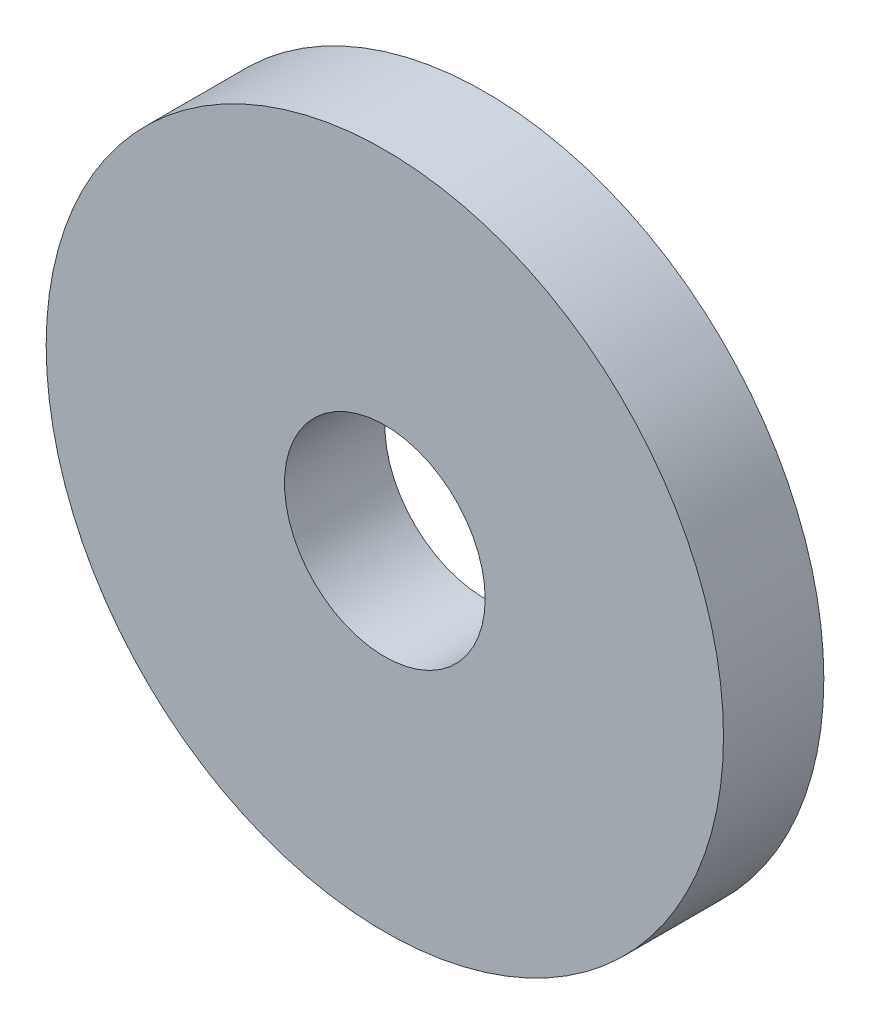
ISO-10303-21;
HEADER;
FILE_DESCRIPTION(('STEP AP214'),'2;1');
FILE_NAME('part.step','',(''),(''),'','','');
FILE_SCHEMA(('AUTOMOTIVE_DESIGN { 1 0 10303 214 1 1 1 1 }'));
ENDSEC;
DATA;
#1=APPLICATION_CONTEXT('core data for automotive mechanical design processes');
#2=APPLICATION_PROTOCOL_DEFINITION('international standard','automotive_design',2000,#1);
#3=PRODUCT_CONTEXT('',#1,'mechanical');
#4=PRODUCT('Part','Part','',(#3));
#5=PRODUCT_RELATED_PRODUCT_CATEGORY('part','',(#4));
#6=PRODUCT_DEFINITION_FORMATION('','',#4);
#7=PRODUCT_DEFINITION_CONTEXT('part definition',#1,'design');
#8=PRODUCT_DEFINITION('design','',#6,#7);
#9=PRODUCT_DEFINITION_SHAPE('','',#8);
#10=(LENGTH_UNIT() NAMED_UNIT(*) SI_UNIT(.MILLI.,.METRE.));
#11=(NAMED_UNIT(*) PLANE_ANGLE_UNIT() SI_UNIT($,.RADIAN.));
#12=(NAMED_UNIT(*) SI_UNIT($,.STERADIAN.) SOLID_ANGLE_UNIT());
#13=UNCERTAINTY_MEASURE_WITH_UNIT(LENGTH_MEASURE(1.E-05),#10,'distance_accuracy_value','');
#14=(GEOMETRIC_REPRESENTATION_CONTEXT(3) GLOBAL_UNCERTAINTY_ASSIGNED_CONTEXT((#13)) GLOBAL_UNIT_ASSIGNED_CONTEXT((#10,
#11,#12)) REPRESENTATION_CONTEXT('',''));
#15=CARTESIAN_POINT('',(0.,0.,0.));
#16=DIRECTION('',(0.,0.,1.));
#17=DIRECTION('',(1.,0.,0.));
#18=AXIS2_PLACEMENT_3D('',#15,#16,#17);
#19=CARTESIAN_POINT('',(0.,0.,4.));
#20=DIRECTION('',(0.,0.,1.));
#21=DIRECTION('',(1.,0.,0.));
#22=AXIS2_PLACEMENT_3D('',#19,#20,#21);
#23=PLANE('',#22);
#24=CARTESIAN_POINT('',(0.,0.,4.));
#25=DIRECTION('',(0.,0.,1.));
#26=DIRECTION('',(1.,0.,0.));
#27=AXIS2_PLACEMENT_3D('',#24,#25,#26);
#28=CIRCLE('',#27,13.5);
#29=CARTESIAN_POINT('',(13.5,0.,4.));
#30=VERTEX_POINT('',#29);
#31=EDGE_CURVE('E10',#30,#30,#28,.T.);
#32=ORIENTED_EDGE('',*,*,#31,.T.);
#33=EDGE_LOOP('',(#32));
#34=FACE_BOUND('',#33,.T.);
#35=CARTESIAN_POINT('',(0.,0.,4.));
#36=DIRECTION('',(0.,0.,1.));
#37=DIRECTION('',(1.,0.,0.));
#38=AXIS2_PLACEMENT_3D('',#35,#36,#37);
#39=CIRCLE('',#38,4.);
#40=CARTESIAN_POINT('',(4.,0.,4.));
#41=VERTEX_POINT('',#40);
#42=EDGE_CURVE('E42',#41,#41,#39,.T.);
#43=ORIENTED_EDGE('',*,*,#42,.F.);
#44=EDGE_LOOP('',(#43));
#45=FACE_BOUND('',#44,.T.);
#46=ADVANCED_FACE('F31',(#34,#45),#23,.T.);
#47=CARTESIAN_POINT('',(0.,0.,0.));
#48=DIRECTION('',(0.,0.,1.));
#49=DIRECTION('',(1.,0.,0.));
#50=AXIS2_PLACEMENT_3D('',#47,#48,#49);
#51=PLANE('',#50);
#52=CARTESIAN_POINT('',(0.,0.,0.));
#53=DIRECTION('',(0.,0.,1.));
#54=DIRECTION('',(1.,0.,0.));
#55=AXIS2_PLACEMENT_3D('',#52,#53,#54);
#56=CIRCLE('',#55,13.5);
#57=CARTESIAN_POINT('',(13.5,0.,0.));
#58=VERTEX_POINT('',#57);
#59=EDGE_CURVE('E35',#58,#58,#56,.T.);
#60=ORIENTED_EDGE('',*,*,#59,.F.);
#61=EDGE_LOOP('',(#60));
#62=FACE_BOUND('',#61,.T.);
#63=CARTESIAN_POINT('',(0.,0.,0.));
#64=DIRECTION('',(0.,0.,1.));
#65=DIRECTION('',(1.,0.,0.));
#66=AXIS2_PLACEMENT_3D('',#63,#64,#65);
#67=CIRCLE('',#66,4.);
#68=CARTESIAN_POINT('',(4.,0.,0.));
#69=VERTEX_POINT('',#68);
#70=EDGE_CURVE('E44',#69,#69,#67,.T.);
#71=ORIENTED_EDGE('',*,*,#70,.T.);
#72=EDGE_LOOP('',(#71));
#73=FACE_BOUND('',#72,.T.);
#74=ADVANCED_FACE('F54',(#62,#73),#51,.F.);
#75=CARTESIAN_POINT('',(0.,0.,4.));
#76=DIRECTION('',(0.,0.,-1.));
#77=DIRECTION('',(-1.,0.,0.));
#78=AXIS2_PLACEMENT_3D('',#75,#76,#77);
#79=CYLINDRICAL_SURFACE('',#78,13.5);
#80=ORIENTED_EDGE('',*,*,#31,.F.);
#81=EDGE_LOOP('',(#80));
#82=FACE_BOUND('',#81,.T.);
#83=ORIENTED_EDGE('',*,*,#59,.T.);
#84=EDGE_LOOP('',(#83));
#85=FACE_BOUND('',#84,.T.);
#86=ADVANCED_FACE('F33',(#82,#85),#79,.T.);
#87=CARTESIAN_POINT('',(0.,0.,4.));
#88=DIRECTION('',(0.,0.,-1.));
#89=DIRECTION('',(-1.,0.,0.));
#90=AXIS2_PLACEMENT_3D('',#87,#88,#89);
#91=CYLINDRICAL_SURFACE('',#90,4.);
#92=ORIENTED_EDGE('',*,*,#42,.T.);
#93=EDGE_LOOP('',(#92));
#94=FACE_BOUND('',#93,.T.);
#95=ORIENTED_EDGE('',*,*,#70,.F.);
#96=EDGE_LOOP('',(#95));
#97=FACE_BOUND('',#96,.T.);
#98=ADVANCED_FACE('F50',(#94,#97),#91,.F.);
#99=CLOSED_SHELL('',(#46,#74,#86,#98));
#100=MANIFOLD_SOLID_BREP('B2',#99);
#101=ADVANCED_BREP_SHAPE_REPRESENTATION('',(#18,#100),#14);
#102=SHAPE_DEFINITION_REPRESENTATION(#9,#101);
ENDSEC;
END-ISO-10303-21;
